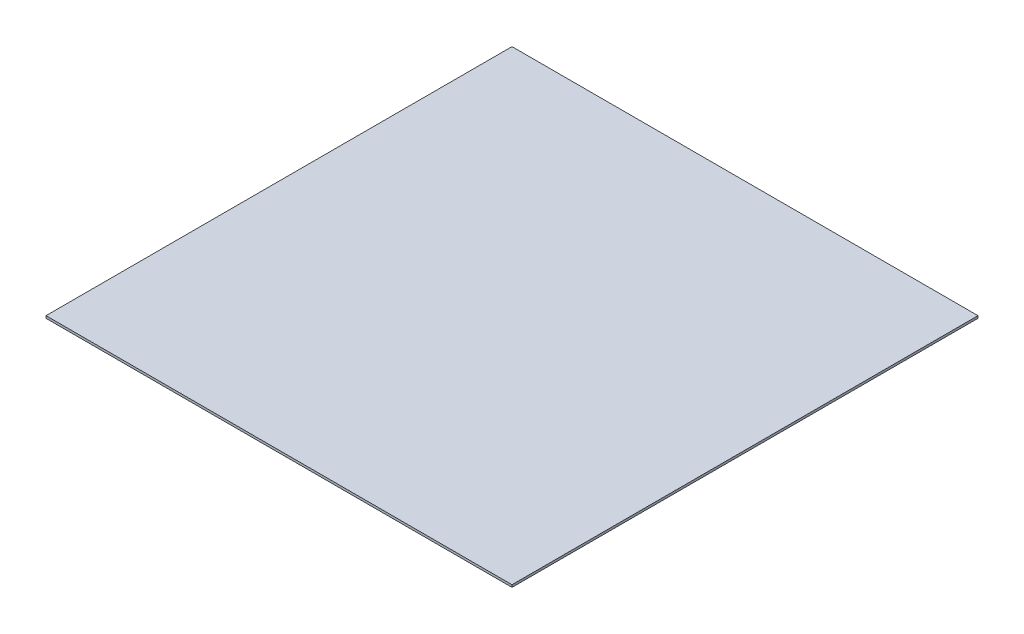
ISO-10303-21;
HEADER;
FILE_DESCRIPTION(('STEP AP214'),'2;1');
FILE_NAME('part.step','',(''),(''),'','','');
FILE_SCHEMA(('AUTOMOTIVE_DESIGN { 1 0 10303 214 1 1 1 1 }'));
ENDSEC;
DATA;
#1=APPLICATION_CONTEXT('core data for automotive mechanical design processes');
#2=APPLICATION_PROTOCOL_DEFINITION('international standard','automotive_design',2000,#1);
#3=PRODUCT_CONTEXT('',#1,'mechanical');
#4=PRODUCT('Part','Part','',(#3));
#5=PRODUCT_RELATED_PRODUCT_CATEGORY('part','',(#4));
#6=PRODUCT_DEFINITION_FORMATION('','',#4);
#7=PRODUCT_DEFINITION_CONTEXT('part definition',#1,'design');
#8=PRODUCT_DEFINITION('design','',#6,#7);
#9=PRODUCT_DEFINITION_SHAPE('','',#8);
#10=(LENGTH_UNIT() NAMED_UNIT(*) SI_UNIT(.MILLI.,.METRE.));
#11=(NAMED_UNIT(*) PLANE_ANGLE_UNIT() SI_UNIT($,.RADIAN.));
#12=(NAMED_UNIT(*) SI_UNIT($,.STERADIAN.) SOLID_ANGLE_UNIT());
#13=UNCERTAINTY_MEASURE_WITH_UNIT(LENGTH_MEASURE(1.E-05),#10,'distance_accuracy_value','');
#14=(GEOMETRIC_REPRESENTATION_CONTEXT(3) GLOBAL_UNCERTAINTY_ASSIGNED_CONTEXT((#13)) GLOBAL_UNIT_ASSIGNED_CONTEXT((#10,
#11,#12)) REPRESENTATION_CONTEXT('',''));
#15=CARTESIAN_POINT('',(0.,0.,0.));
#16=DIRECTION('',(0.,0.,1.));
#17=DIRECTION('',(1.,0.,0.));
#18=AXIS2_PLACEMENT_3D('',#15,#16,#17);
#19=CARTESIAN_POINT('',(-1000.,10.,1000.));
#20=DIRECTION('',(1.,0.,0.));
#21=DIRECTION('',(0.,0.,-1.));
#22=AXIS2_PLACEMENT_3D('',#19,#20,#21);
#23=PLANE('',#22);
#24=DIRECTION('',(0.,0.,1.));
#25=VECTOR('',#24,1.);
#26=CARTESIAN_POINT('',(-1000.,0.,1000.));
#27=LINE('',#26,#25);
#28=CARTESIAN_POINT('',(-1000.,0.,-1000.));
#29=VERTEX_POINT('',#28);
#30=CARTESIAN_POINT('',(-1000.,0.,1000.));
#31=VERTEX_POINT('',#30);
#32=EDGE_CURVE('E102',#29,#31,#27,.T.);
#33=ORIENTED_EDGE('',*,*,#32,.T.);
#34=DIRECTION('',(0.,-1.,0.));
#35=VECTOR('',#34,1.);
#36=CARTESIAN_POINT('',(-1000.,10.,1000.));
#37=LINE('',#36,#35);
#38=CARTESIAN_POINT('',(-1000.,10.,1000.));
#39=VERTEX_POINT('',#38);
#40=EDGE_CURVE('E11',#39,#31,#37,.T.);
#41=ORIENTED_EDGE('',*,*,#40,.F.);
#42=DIRECTION('',(0.,0.,1.));
#43=VECTOR('',#42,1.);
#44=CARTESIAN_POINT('',(-1000.,10.,1000.));
#45=LINE('',#44,#43);
#46=CARTESIAN_POINT('',(-1000.,10.,-1000.));
#47=VERTEX_POINT('',#46);
#48=EDGE_CURVE('E90',#47,#39,#45,.T.);
#49=ORIENTED_EDGE('',*,*,#48,.F.);
#50=DIRECTION('',(0.,-1.,0.));
#51=VECTOR('',#50,1.);
#52=CARTESIAN_POINT('',(-1000.,10.,-1000.));
#53=LINE('',#52,#51);
#54=EDGE_CURVE('E98',#47,#29,#53,.T.);
#55=ORIENTED_EDGE('',*,*,#54,.T.);
#56=EDGE_LOOP('',(#33,#41,#49,#55));
#57=FACE_BOUND('',#56,.T.);
#58=ADVANCED_FACE('F39',(#57),#23,.F.);
#59=CARTESIAN_POINT('',(-1000.,10.,1000.));
#60=DIRECTION('',(0.,0.,-1.));
#61=DIRECTION('',(-1.,0.,0.));
#62=AXIS2_PLACEMENT_3D('',#59,#60,#61);
#63=PLANE('',#62);
#64=DIRECTION('',(1.,0.,0.));
#65=VECTOR('',#64,1.);
#66=CARTESIAN_POINT('',(-1000.,0.,1000.));
#67=LINE('',#66,#65);
#68=CARTESIAN_POINT('',(1000.,0.,1000.));
#69=VERTEX_POINT('',#68);
#70=EDGE_CURVE('E94',#31,#69,#67,.T.);
#71=ORIENTED_EDGE('',*,*,#70,.T.);
#72=DIRECTION('',(0.,-1.,0.));
#73=VECTOR('',#72,1.);
#74=CARTESIAN_POINT('',(1000.,10.,1000.));
#75=LINE('',#74,#73);
#76=CARTESIAN_POINT('',(1000.,10.,1000.));
#77=VERTEX_POINT('',#76);
#78=EDGE_CURVE('E47',#77,#69,#75,.T.);
#79=ORIENTED_EDGE('',*,*,#78,.F.);
#80=DIRECTION('',(1.,0.,0.));
#81=VECTOR('',#80,1.);
#82=CARTESIAN_POINT('',(-1000.,10.,1000.));
#83=LINE('',#82,#81);
#84=EDGE_CURVE('E85',#39,#77,#83,.T.);
#85=ORIENTED_EDGE('',*,*,#84,.F.);
#86=ORIENTED_EDGE('',*,*,#40,.T.);
#87=EDGE_LOOP('',(#71,#79,#85,#86));
#88=FACE_BOUND('',#87,.T.);
#89=ADVANCED_FACE('F93',(#88),#63,.F.);
#90=CARTESIAN_POINT('',(1000.,10.,1000.));
#91=DIRECTION('',(-1.,0.,0.));
#92=DIRECTION('',(0.,0.,1.));
#93=AXIS2_PLACEMENT_3D('',#90,#91,#92);
#94=PLANE('',#93);
#95=DIRECTION('',(0.,0.,-1.));
#96=VECTOR('',#95,1.);
#97=CARTESIAN_POINT('',(1000.,0.,1000.));
#98=LINE('',#97,#96);
#99=CARTESIAN_POINT('',(1000.,0.,-1000.));
#100=VERTEX_POINT('',#99);
#101=EDGE_CURVE('E72',#69,#100,#98,.T.);
#102=ORIENTED_EDGE('',*,*,#101,.T.);
#103=DIRECTION('',(0.,-1.,0.));
#104=VECTOR('',#103,1.);
#105=CARTESIAN_POINT('',(1000.,10.,-1000.));
#106=LINE('',#105,#104);
#107=CARTESIAN_POINT('',(1000.,10.,-1000.));
#108=VERTEX_POINT('',#107);
#109=EDGE_CURVE('E95',#108,#100,#106,.T.);
#110=ORIENTED_EDGE('',*,*,#109,.F.);
#111=DIRECTION('',(0.,0.,-1.));
#112=VECTOR('',#111,1.);
#113=CARTESIAN_POINT('',(1000.,10.,1000.));
#114=LINE('',#113,#112);
#115=EDGE_CURVE('E88',#77,#108,#114,.T.);
#116=ORIENTED_EDGE('',*,*,#115,.F.);
#117=ORIENTED_EDGE('',*,*,#78,.T.);
#118=EDGE_LOOP('',(#102,#110,#116,#117));
#119=FACE_BOUND('',#118,.T.);
#120=ADVANCED_FACE('F96',(#119),#94,.F.);
#121=CARTESIAN_POINT('',(-1000.,10.,-1000.));
#122=DIRECTION('',(0.,0.,1.));
#123=DIRECTION('',(1.,0.,0.));
#124=AXIS2_PLACEMENT_3D('',#121,#122,#123);
#125=PLANE('',#124);
#126=DIRECTION('',(-1.,0.,0.));
#127=VECTOR('',#126,1.);
#128=CARTESIAN_POINT('',(-1000.,0.,-1000.));
#129=LINE('',#128,#127);
#130=EDGE_CURVE('E78',#100,#29,#129,.T.);
#131=ORIENTED_EDGE('',*,*,#130,.T.);
#132=ORIENTED_EDGE('',*,*,#54,.F.);
#133=DIRECTION('',(-1.,0.,0.));
#134=VECTOR('',#133,1.);
#135=CARTESIAN_POINT('',(-1000.,10.,-1000.));
#136=LINE('',#135,#134);
#137=EDGE_CURVE('E55',#108,#47,#136,.T.);
#138=ORIENTED_EDGE('',*,*,#137,.F.);
#139=ORIENTED_EDGE('',*,*,#109,.T.);
#140=EDGE_LOOP('',(#131,#132,#138,#139));
#141=FACE_BOUND('',#140,.T.);
#142=ADVANCED_FACE('F109',(#141),#125,.F.);
#143=CARTESIAN_POINT('',(0.,10.,0.));
#144=DIRECTION('',(0.,-1.,0.));
#145=DIRECTION('',(0.,0.,-1.));
#146=AXIS2_PLACEMENT_3D('',#143,#144,#145);
#147=PLANE('',#146);
#148=ORIENTED_EDGE('',*,*,#48,.T.);
#149=ORIENTED_EDGE('',*,*,#84,.T.);
#150=ORIENTED_EDGE('',*,*,#115,.T.);
#151=ORIENTED_EDGE('',*,*,#137,.T.);
#152=EDGE_LOOP('',(#148,#149,#150,#151));
#153=FACE_BOUND('',#152,.T.);
#154=ADVANCED_FACE('F86',(#153),#147,.F.);
#155=CARTESIAN_POINT('',(0.,0.,0.));
#156=DIRECTION('',(0.,-1.,0.));
#157=DIRECTION('',(0.,0.,-1.));
#158=AXIS2_PLACEMENT_3D('',#155,#156,#157);
#159=PLANE('',#158);
#160=ORIENTED_EDGE('',*,*,#32,.F.);
#161=ORIENTED_EDGE('',*,*,#130,.F.);
#162=ORIENTED_EDGE('',*,*,#101,.F.);
#163=ORIENTED_EDGE('',*,*,#70,.F.);
#164=EDGE_LOOP('',(#160,#161,#162,#163));
#165=FACE_BOUND('',#164,.T.);
#166=ADVANCED_FACE('F112',(#165),#159,.T.);
#167=CLOSED_SHELL('',(#58,#89,#120,#142,#154,#166));
#168=MANIFOLD_SOLID_BREP('B2',#167);
#169=ADVANCED_BREP_SHAPE_REPRESENTATION('',(#18,#168),#14);
#170=SHAPE_DEFINITION_REPRESENTATION(#9,#169);
ENDSEC;
END-ISO-10303-21;
